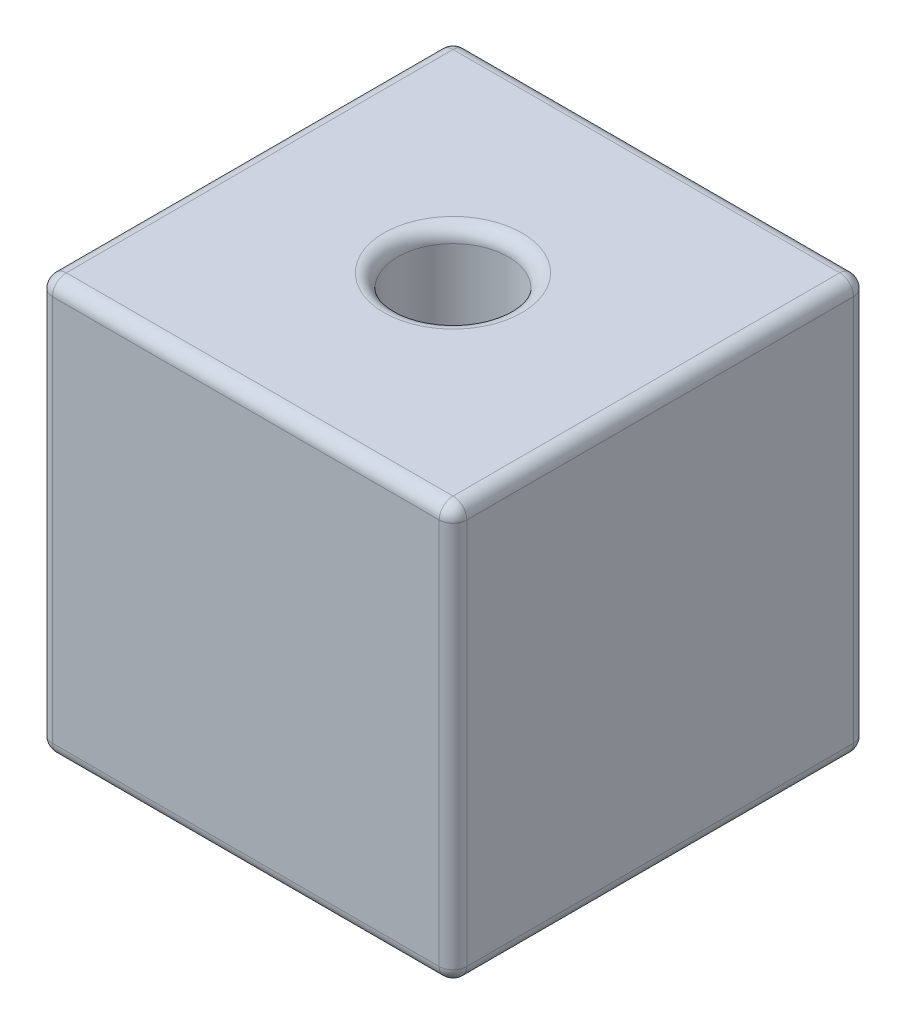
ISO-10303-21;
HEADER;
FILE_DESCRIPTION(('STEP AP214'),'2;1');
FILE_NAME('part.step','',(''),(''),'','','');
FILE_SCHEMA(('AUTOMOTIVE_DESIGN { 1 0 10303 214 1 1 1 1 }'));
ENDSEC;
DATA;
#1=APPLICATION_CONTEXT('core data for automotive mechanical design processes');
#2=APPLICATION_PROTOCOL_DEFINITION('international standard','automotive_design',2000,#1);
#3=PRODUCT_CONTEXT('',#1,'mechanical');
#4=PRODUCT('Part','Part','',(#3));
#5=PRODUCT_RELATED_PRODUCT_CATEGORY('part','',(#4));
#6=PRODUCT_DEFINITION_FORMATION('','',#4);
#7=PRODUCT_DEFINITION_CONTEXT('part definition',#1,'design');
#8=PRODUCT_DEFINITION('design','',#6,#7);
#9=PRODUCT_DEFINITION_SHAPE('','',#8);
#10=(LENGTH_UNIT() NAMED_UNIT(*) SI_UNIT(.MILLI.,.METRE.));
#11=(NAMED_UNIT(*) PLANE_ANGLE_UNIT() SI_UNIT($,.RADIAN.));
#12=(NAMED_UNIT(*) SI_UNIT($,.STERADIAN.) SOLID_ANGLE_UNIT());
#13=UNCERTAINTY_MEASURE_WITH_UNIT(LENGTH_MEASURE(1.E-05),#10,'distance_accuracy_value','');
#14=(GEOMETRIC_REPRESENTATION_CONTEXT(3) GLOBAL_UNCERTAINTY_ASSIGNED_CONTEXT((#13)) GLOBAL_UNIT_ASSIGNED_CONTEXT((#10,
#11,#12)) REPRESENTATION_CONTEXT('',''));
#15=CARTESIAN_POINT('',(0.,0.,0.));
#16=DIRECTION('',(0.,0.,1.));
#17=DIRECTION('',(1.,0.,0.));
#18=AXIS2_PLACEMENT_3D('',#15,#16,#17);
#19=CARTESIAN_POINT('',(15.,30.,-15.));
#20=DIRECTION('',(-1.,0.,0.));
#21=DIRECTION('',(0.,0.,1.));
#22=AXIS2_PLACEMENT_3D('',#19,#20,#21);
#23=PLANE('',#22);
#24=DIRECTION('',(0.,-1.,0.));
#25=VECTOR('',#24,1.);
#26=CARTESIAN_POINT('',(15.,30.,14.));
#27=LINE('',#26,#25);
#28=CARTESIAN_POINT('',(15.,29.,14.));
#29=VERTEX_POINT('',#28);
#30=CARTESIAN_POINT('',(15.,1.,14.));
#31=VERTEX_POINT('',#30);
#32=EDGE_CURVE('E155',#29,#31,#27,.T.);
#33=ORIENTED_EDGE('',*,*,#32,.T.);
#34=DIRECTION('',(0.,0.,-1.));
#35=VECTOR('',#34,1.);
#36=CARTESIAN_POINT('',(15.,1.,-15.));
#37=LINE('',#36,#35);
#38=CARTESIAN_POINT('',(15.,1.,-14.));
#39=VERTEX_POINT('',#38);
#40=EDGE_CURVE('E193',#31,#39,#37,.T.);
#41=ORIENTED_EDGE('',*,*,#40,.T.);
#42=DIRECTION('',(0.,-1.,0.));
#43=VECTOR('',#42,1.);
#44=CARTESIAN_POINT('',(15.,30.,-14.));
#45=LINE('',#44,#43);
#46=CARTESIAN_POINT('',(15.,29.,-14.));
#47=VERTEX_POINT('',#46);
#48=EDGE_CURVE('E190',#39,#47,#45,.F.);
#49=ORIENTED_EDGE('',*,*,#48,.T.);
#50=DIRECTION('',(0.,0.,-1.));
#51=VECTOR('',#50,1.);
#52=CARTESIAN_POINT('',(15.,29.,15.));
#53=LINE('',#52,#51);
#54=EDGE_CURVE('E188',#47,#29,#53,.F.);
#55=ORIENTED_EDGE('',*,*,#54,.T.);
#56=EDGE_LOOP('',(#33,#41,#49,#55));
#57=FACE_BOUND('',#56,.T.);
#58=ADVANCED_FACE('F47',(#57),#23,.F.);
#59=CARTESIAN_POINT('',(-15.,30.,-15.));
#60=DIRECTION('',(0.,0.,1.));
#61=DIRECTION('',(1.,0.,0.));
#62=AXIS2_PLACEMENT_3D('',#59,#60,#61);
#63=PLANE('',#62);
#64=DIRECTION('',(0.,-1.,0.));
#65=VECTOR('',#64,1.);
#66=CARTESIAN_POINT('',(14.,30.,-15.));
#67=LINE('',#66,#65);
#68=CARTESIAN_POINT('',(14.,29.,-15.));
#69=VERTEX_POINT('',#68);
#70=CARTESIAN_POINT('',(14.,1.,-15.));
#71=VERTEX_POINT('',#70);
#72=EDGE_CURVE('E199',#69,#71,#67,.T.);
#73=ORIENTED_EDGE('',*,*,#72,.T.);
#74=DIRECTION('',(-1.,0.,0.));
#75=VECTOR('',#74,1.);
#76=CARTESIAN_POINT('',(-15.,1.,-15.));
#77=LINE('',#76,#75);
#78=CARTESIAN_POINT('',(-14.,1.,-15.));
#79=VERTEX_POINT('',#78);
#80=EDGE_CURVE('E202',#71,#79,#77,.T.);
#81=ORIENTED_EDGE('',*,*,#80,.T.);
#82=DIRECTION('',(0.,-1.,0.));
#83=VECTOR('',#82,1.);
#84=CARTESIAN_POINT('',(-14.,30.,-15.));
#85=LINE('',#84,#83);
#86=CARTESIAN_POINT('',(-14.,29.,-15.));
#87=VERTEX_POINT('',#86);
#88=EDGE_CURVE('E197',#79,#87,#85,.F.);
#89=ORIENTED_EDGE('',*,*,#88,.T.);
#90=DIRECTION('',(-1.,0.,0.));
#91=VECTOR('',#90,1.);
#92=CARTESIAN_POINT('',(15.,29.,-15.));
#93=LINE('',#92,#91);
#94=EDGE_CURVE('E195',#87,#69,#93,.F.);
#95=ORIENTED_EDGE('',*,*,#94,.T.);
#96=EDGE_LOOP('',(#73,#81,#89,#95));
#97=FACE_BOUND('',#96,.T.);
#98=ADVANCED_FACE('F320',(#97),#63,.F.);
#99=CARTESIAN_POINT('',(-15.,30.,-15.));
#100=DIRECTION('',(1.,0.,0.));
#101=DIRECTION('',(0.,0.,-1.));
#102=AXIS2_PLACEMENT_3D('',#99,#100,#101);
#103=PLANE('',#102);
#104=DIRECTION('',(0.,-1.,0.));
#105=VECTOR('',#104,1.);
#106=CARTESIAN_POINT('',(-15.,30.,-14.));
#107=LINE('',#106,#105);
#108=CARTESIAN_POINT('',(-15.,29.,-14.));
#109=VERTEX_POINT('',#108);
#110=CARTESIAN_POINT('',(-15.,1.,-14.));
#111=VERTEX_POINT('',#110);
#112=EDGE_CURVE('E181',#109,#111,#107,.T.);
#113=ORIENTED_EDGE('',*,*,#112,.T.);
#114=DIRECTION('',(0.,0.,1.));
#115=VECTOR('',#114,1.);
#116=CARTESIAN_POINT('',(-15.,1.,-15.));
#117=LINE('',#116,#115);
#118=CARTESIAN_POINT('',(-15.,1.,14.));
#119=VERTEX_POINT('',#118);
#120=EDGE_CURVE('E186',#111,#119,#117,.T.);
#121=ORIENTED_EDGE('',*,*,#120,.T.);
#122=DIRECTION('',(0.,-1.,0.));
#123=VECTOR('',#122,1.);
#124=CARTESIAN_POINT('',(-15.,30.,14.));
#125=LINE('',#124,#123);
#126=CARTESIAN_POINT('',(-15.,29.,14.));
#127=VERTEX_POINT('',#126);
#128=EDGE_CURVE('E183',#119,#127,#125,.F.);
#129=ORIENTED_EDGE('',*,*,#128,.T.);
#130=DIRECTION('',(0.,0.,1.));
#131=VECTOR('',#130,1.);
#132=CARTESIAN_POINT('',(-15.,29.,-15.));
#133=LINE('',#132,#131);
#134=EDGE_CURVE('E179',#127,#109,#133,.F.);
#135=ORIENTED_EDGE('',*,*,#134,.T.);
#136=EDGE_LOOP('',(#113,#121,#129,#135));
#137=FACE_BOUND('',#136,.T.);
#138=ADVANCED_FACE('F311',(#137),#103,.F.);
#139=CARTESIAN_POINT('',(-15.,30.,15.));
#140=DIRECTION('',(0.,0.,-1.));
#141=DIRECTION('',(-1.,0.,0.));
#142=AXIS2_PLACEMENT_3D('',#139,#140,#141);
#143=PLANE('',#142);
#144=DIRECTION('',(0.,-1.,0.));
#145=VECTOR('',#144,1.);
#146=CARTESIAN_POINT('',(-14.,30.,15.));
#147=LINE('',#146,#145);
#148=CARTESIAN_POINT('',(-14.,29.,15.));
#149=VERTEX_POINT('',#148);
#150=CARTESIAN_POINT('',(-14.,1.,15.));
#151=VERTEX_POINT('',#150);
#152=EDGE_CURVE('E147',#149,#151,#147,.T.);
#153=ORIENTED_EDGE('',*,*,#152,.T.);
#154=DIRECTION('',(1.,0.,0.));
#155=VECTOR('',#154,1.);
#156=CARTESIAN_POINT('',(-15.,1.,15.));
#157=LINE('',#156,#155);
#158=CARTESIAN_POINT('',(14.,1.,15.));
#159=VERTEX_POINT('',#158);
#160=EDGE_CURVE('E143',#151,#159,#157,.T.);
#161=ORIENTED_EDGE('',*,*,#160,.T.);
#162=DIRECTION('',(0.,-1.,0.));
#163=VECTOR('',#162,1.);
#164=CARTESIAN_POINT('',(14.,30.,15.));
#165=LINE('',#164,#163);
#166=CARTESIAN_POINT('',(14.,29.,15.));
#167=VERTEX_POINT('',#166);
#168=EDGE_CURVE('E135',#159,#167,#165,.F.);
#169=ORIENTED_EDGE('',*,*,#168,.T.);
#170=DIRECTION('',(1.,0.,0.));
#171=VECTOR('',#170,1.);
#172=CARTESIAN_POINT('',(-15.,29.,15.));
#173=LINE('',#172,#171);
#174=EDGE_CURVE('E140',#167,#149,#173,.F.);
#175=ORIENTED_EDGE('',*,*,#174,.T.);
#176=EDGE_LOOP('',(#153,#161,#169,#175));
#177=FACE_BOUND('',#176,.T.);
#178=ADVANCED_FACE('F138',(#177),#143,.F.);
#179=CARTESIAN_POINT('',(0.,30.,0.));
#180=DIRECTION('',(0.,1.,0.));
#181=DIRECTION('',(0.,0.,1.));
#182=AXIS2_PLACEMENT_3D('',#179,#180,#181);
#183=PLANE('',#182);
#184=DIRECTION('',(0.,0.,1.));
#185=VECTOR('',#184,1.);
#186=CARTESIAN_POINT('',(-14.,30.,15.));
#187=LINE('',#186,#185);
#188=CARTESIAN_POINT('',(-14.,30.,-14.));
#189=VERTEX_POINT('',#188);
#190=CARTESIAN_POINT('',(-14.,30.,14.));
#191=VERTEX_POINT('',#190);
#192=EDGE_CURVE('E56',#189,#191,#187,.T.);
#193=ORIENTED_EDGE('',*,*,#192,.T.);
#194=DIRECTION('',(1.,0.,0.));
#195=VECTOR('',#194,1.);
#196=CARTESIAN_POINT('',(15.,30.,14.));
#197=LINE('',#196,#195);
#198=CARTESIAN_POINT('',(14.,30.,14.));
#199=VERTEX_POINT('',#198);
#200=EDGE_CURVE('E11',#191,#199,#197,.T.);
#201=ORIENTED_EDGE('',*,*,#200,.T.);
#202=DIRECTION('',(0.,0.,-1.));
#203=VECTOR('',#202,1.);
#204=CARTESIAN_POINT('',(14.,30.,-15.));
#205=LINE('',#204,#203);
#206=CARTESIAN_POINT('',(14.,30.,-14.));
#207=VERTEX_POINT('',#206);
#208=EDGE_CURVE('E225',#199,#207,#205,.T.);
#209=ORIENTED_EDGE('',*,*,#208,.T.);
#210=DIRECTION('',(-1.,0.,0.));
#211=VECTOR('',#210,1.);
#212=CARTESIAN_POINT('',(-15.,30.,-14.));
#213=LINE('',#212,#211);
#214=EDGE_CURVE('E67',#207,#189,#213,.T.);
#215=ORIENTED_EDGE('',*,*,#214,.T.);
#216=EDGE_LOOP('',(#193,#201,#209,#215));
#217=FACE_BOUND('',#216,.T.);
#218=CARTESIAN_POINT('',(0.,30.,0.));
#219=DIRECTION('',(0.,1.,0.));
#220=DIRECTION('',(0.,0.,1.));
#221=AXIS2_PLACEMENT_3D('',#218,#219,#220);
#222=CIRCLE('',#221,5.);
#223=CARTESIAN_POINT('',(0.,30.,5.));
#224=VERTEX_POINT('',#223);
#225=EDGE_CURVE('E222',#224,#224,#222,.F.);
#226=ORIENTED_EDGE('',*,*,#225,.T.);
#227=EDGE_LOOP('',(#226));
#228=FACE_BOUND('',#227,.T.);
#229=ADVANCED_FACE('F334',(#217,#228),#183,.T.);
#230=CARTESIAN_POINT('',(0.,0.,0.));
#231=DIRECTION('',(0.,1.,0.));
#232=DIRECTION('',(0.,0.,1.));
#233=AXIS2_PLACEMENT_3D('',#230,#231,#232);
#234=PLANE('',#233);
#235=DIRECTION('',(0.,0.,1.));
#236=VECTOR('',#235,1.);
#237=CARTESIAN_POINT('',(-14.,0.,0.));
#238=LINE('',#237,#236);
#239=CARTESIAN_POINT('',(-14.,0.,14.));
#240=VERTEX_POINT('',#239);
#241=CARTESIAN_POINT('',(-14.,0.,-14.));
#242=VERTEX_POINT('',#241);
#243=EDGE_CURVE('E211',#240,#242,#238,.F.);
#244=ORIENTED_EDGE('',*,*,#243,.T.);
#245=DIRECTION('',(-1.,0.,0.));
#246=VECTOR('',#245,1.);
#247=CARTESIAN_POINT('',(0.,0.,-14.));
#248=LINE('',#247,#246);
#249=CARTESIAN_POINT('',(14.,0.,-14.));
#250=VERTEX_POINT('',#249);
#251=EDGE_CURVE('E213',#242,#250,#248,.F.);
#252=ORIENTED_EDGE('',*,*,#251,.T.);
#253=DIRECTION('',(0.,0.,-1.));
#254=VECTOR('',#253,1.);
#255=CARTESIAN_POINT('',(14.,0.,0.));
#256=LINE('',#255,#254);
#257=CARTESIAN_POINT('',(14.,0.,14.));
#258=VERTEX_POINT('',#257);
#259=EDGE_CURVE('E207',#250,#258,#256,.F.);
#260=ORIENTED_EDGE('',*,*,#259,.T.);
#261=DIRECTION('',(1.,0.,0.));
#262=VECTOR('',#261,1.);
#263=CARTESIAN_POINT('',(0.,0.,14.));
#264=LINE('',#263,#262);
#265=EDGE_CURVE('E209',#258,#240,#264,.F.);
#266=ORIENTED_EDGE('',*,*,#265,.T.);
#267=EDGE_LOOP('',(#244,#252,#260,#266));
#268=FACE_BOUND('',#267,.T.);
#269=CARTESIAN_POINT('',(0.,0.,0.));
#270=DIRECTION('',(0.,1.,0.));
#271=DIRECTION('',(0.,0.,1.));
#272=AXIS2_PLACEMENT_3D('',#269,#270,#271);
#273=CIRCLE('',#272,5.);
#274=CARTESIAN_POINT('',(0.,0.,5.));
#275=VERTEX_POINT('',#274);
#276=EDGE_CURVE('E204',#275,#275,#273,.T.);
#277=ORIENTED_EDGE('',*,*,#276,.T.);
#278=EDGE_LOOP('',(#277));
#279=FACE_BOUND('',#278,.T.);
#280=ADVANCED_FACE('F292',(#268,#279),#234,.F.);
#281=CARTESIAN_POINT('',(0.,-1.,0.));
#282=DIRECTION('',(0.,1.,0.));
#283=DIRECTION('',(0.,0.,1.));
#284=AXIS2_PLACEMENT_3D('',#281,#282,#283);
#285=CYLINDRICAL_SURFACE('',#284,4.);
#286=CARTESIAN_POINT('',(0.,1.,0.));
#287=DIRECTION('',(0.,1.,0.));
#288=DIRECTION('',(0.,0.,1.));
#289=AXIS2_PLACEMENT_3D('',#286,#287,#288);
#290=CIRCLE('',#289,4.);
#291=CARTESIAN_POINT('',(0.,1.,4.));
#292=VERTEX_POINT('',#291);
#293=EDGE_CURVE('E219',#292,#292,#290,.F.);
#294=ORIENTED_EDGE('',*,*,#293,.T.);
#295=EDGE_LOOP('',(#294));
#296=FACE_BOUND('',#295,.T.);
#297=CARTESIAN_POINT('',(0.,29.,0.));
#298=DIRECTION('',(0.,1.,0.));
#299=DIRECTION('',(0.,0.,1.));
#300=AXIS2_PLACEMENT_3D('',#297,#298,#299);
#301=CIRCLE('',#300,4.);
#302=CARTESIAN_POINT('',(0.,29.,4.));
#303=VERTEX_POINT('',#302);
#304=EDGE_CURVE('E216',#303,#303,#301,.T.);
#305=ORIENTED_EDGE('',*,*,#304,.T.);
#306=EDGE_LOOP('',(#305));
#307=FACE_BOUND('',#306,.T.);
#308=ADVANCED_FACE('F524',(#296,#307),#285,.F.);
#309=CARTESIAN_POINT('',(14.,30.,-14.));
#310=DIRECTION('',(0.,-1.,0.));
#311=DIRECTION('',(0.,0.,-1.));
#312=AXIS2_PLACEMENT_3D('',#309,#310,#311);
#313=CYLINDRICAL_SURFACE('',#312,1.);
#314=CARTESIAN_POINT('',(14.,29.,-14.));
#315=DIRECTION('',(0.,1.,0.));
#316=DIRECTION('',(0.,0.,1.));
#317=AXIS2_PLACEMENT_3D('',#314,#315,#316);
#318=CIRCLE('',#317,1.);
#319=EDGE_CURVE('E51',#47,#69,#318,.T.);
#320=ORIENTED_EDGE('',*,*,#319,.F.);
#321=ORIENTED_EDGE('',*,*,#48,.F.);
#322=CARTESIAN_POINT('',(14.,1.,-14.));
#323=DIRECTION('',(0.,-1.,0.));
#324=DIRECTION('',(0.,0.,-1.));
#325=AXIS2_PLACEMENT_3D('',#322,#323,#324);
#326=CIRCLE('',#325,1.);
#327=EDGE_CURVE('E175',#71,#39,#326,.T.);
#328=ORIENTED_EDGE('',*,*,#327,.F.);
#329=ORIENTED_EDGE('',*,*,#72,.F.);
#330=EDGE_LOOP('',(#320,#321,#328,#329));
#331=FACE_BOUND('',#330,.T.);
#332=ADVANCED_FACE('F330',(#331),#313,.T.);
#333=CARTESIAN_POINT('',(14.,29.,-14.));
#334=DIRECTION('',(0.,0.,-1.));
#335=DIRECTION('',(-1.,0.,0.));
#336=AXIS2_PLACEMENT_3D('',#333,#334,#335);
#337=SPHERICAL_SURFACE('',#336,1.);
#338=CARTESIAN_POINT('',(14.,29.,-14.));
#339=DIRECTION('',(0.,0.,-1.));
#340=DIRECTION('',(-1.,0.,0.));
#341=AXIS2_PLACEMENT_3D('',#338,#339,#340);
#342=CIRCLE('',#341,1.);
#343=EDGE_CURVE('E272',#47,#207,#342,.F.);
#344=ORIENTED_EDGE('',*,*,#343,.F.);
#345=ORIENTED_EDGE('',*,*,#319,.T.);
#346=CARTESIAN_POINT('',(14.,29.,-14.));
#347=DIRECTION('',(1.,0.,0.));
#348=DIRECTION('',(0.,0.,-1.));
#349=AXIS2_PLACEMENT_3D('',#346,#347,#348);
#350=CIRCLE('',#349,1.);
#351=EDGE_CURVE('E275',#207,#69,#350,.F.);
#352=ORIENTED_EDGE('',*,*,#351,.F.);
#353=EDGE_LOOP('',(#344,#345,#352));
#354=FACE_BOUND('',#353,.T.);
#355=ADVANCED_FACE('F327',(#354),#337,.T.);
#356=CARTESIAN_POINT('',(14.,1.,-14.));
#357=DIRECTION('',(1.,0.,0.));
#358=DIRECTION('',(0.,1.,0.));
#359=AXIS2_PLACEMENT_3D('',#356,#357,#358);
#360=SPHERICAL_SURFACE('',#359,1.);
#361=CARTESIAN_POINT('',(14.,1.,-14.));
#362=DIRECTION('',(1.,0.,0.));
#363=DIRECTION('',(0.,0.,-1.));
#364=AXIS2_PLACEMENT_3D('',#361,#362,#363);
#365=CIRCLE('',#364,1.);
#366=EDGE_CURVE('E266',#71,#250,#365,.F.);
#367=ORIENTED_EDGE('',*,*,#366,.F.);
#368=ORIENTED_EDGE('',*,*,#327,.T.);
#369=CARTESIAN_POINT('',(14.,1.,-14.));
#370=DIRECTION('',(0.,0.,-1.));
#371=DIRECTION('',(-1.,0.,0.));
#372=AXIS2_PLACEMENT_3D('',#369,#370,#371);
#373=CIRCLE('',#372,1.);
#374=EDGE_CURVE('E269',#250,#39,#373,.F.);
#375=ORIENTED_EDGE('',*,*,#374,.F.);
#376=EDGE_LOOP('',(#367,#368,#375));
#377=FACE_BOUND('',#376,.T.);
#378=ADVANCED_FACE('F282',(#377),#360,.T.);
#379=CARTESIAN_POINT('',(0.,29.,-14.));
#380=DIRECTION('',(1.,0.,0.));
#381=DIRECTION('',(0.,0.,-1.));
#382=AXIS2_PLACEMENT_3D('',#379,#380,#381);
#383=CYLINDRICAL_SURFACE('',#382,1.);
#384=ORIENTED_EDGE('',*,*,#351,.T.);
#385=ORIENTED_EDGE('',*,*,#94,.F.);
#386=CARTESIAN_POINT('',(-14.,29.,-14.));
#387=DIRECTION('',(-1.,0.,0.));
#388=DIRECTION('',(0.,0.,1.));
#389=AXIS2_PLACEMENT_3D('',#386,#387,#388);
#390=CIRCLE('',#389,1.);
#391=EDGE_CURVE('E260',#189,#87,#390,.T.);
#392=ORIENTED_EDGE('',*,*,#391,.F.);
#393=ORIENTED_EDGE('',*,*,#214,.F.);
#394=EDGE_LOOP('',(#384,#385,#392,#393));
#395=FACE_BOUND('',#394,.T.);
#396=ADVANCED_FACE('F322',(#395),#383,.T.);
#397=CARTESIAN_POINT('',(14.,29.,0.));
#398=DIRECTION('',(0.,0.,1.));
#399=DIRECTION('',(1.,0.,0.));
#400=AXIS2_PLACEMENT_3D('',#397,#398,#399);
#401=CYLINDRICAL_SURFACE('',#400,1.);
#402=ORIENTED_EDGE('',*,*,#343,.T.);
#403=ORIENTED_EDGE('',*,*,#208,.F.);
#404=CARTESIAN_POINT('',(14.,29.,14.));
#405=DIRECTION('',(0.,0.,1.));
#406=DIRECTION('',(1.,0.,0.));
#407=AXIS2_PLACEMENT_3D('',#404,#405,#406);
#408=CIRCLE('',#407,1.);
#409=EDGE_CURVE('E159',#29,#199,#408,.T.);
#410=ORIENTED_EDGE('',*,*,#409,.F.);
#411=ORIENTED_EDGE('',*,*,#54,.F.);
#412=EDGE_LOOP('',(#402,#403,#410,#411));
#413=FACE_BOUND('',#412,.T.);
#414=ADVANCED_FACE('F333',(#413),#401,.T.);
#415=CARTESIAN_POINT('',(14.,30.,14.));
#416=DIRECTION('',(0.,-1.,0.));
#417=DIRECTION('',(0.,0.,-1.));
#418=AXIS2_PLACEMENT_3D('',#415,#416,#417);
#419=CYLINDRICAL_SURFACE('',#418,1.);
#420=CARTESIAN_POINT('',(14.,1.,14.));
#421=DIRECTION('',(0.,-1.,0.));
#422=DIRECTION('',(0.,0.,-1.));
#423=AXIS2_PLACEMENT_3D('',#420,#421,#422);
#424=CIRCLE('',#423,1.);
#425=EDGE_CURVE('E160',#31,#159,#424,.T.);
#426=ORIENTED_EDGE('',*,*,#425,.F.);
#427=ORIENTED_EDGE('',*,*,#32,.F.);
#428=CARTESIAN_POINT('',(14.,29.,14.));
#429=DIRECTION('',(0.,1.,0.));
#430=DIRECTION('',(0.,0.,1.));
#431=AXIS2_PLACEMENT_3D('',#428,#429,#430);
#432=CIRCLE('',#431,1.);
#433=EDGE_CURVE('E151',#167,#29,#432,.T.);
#434=ORIENTED_EDGE('',*,*,#433,.F.);
#435=ORIENTED_EDGE('',*,*,#168,.F.);
#436=EDGE_LOOP('',(#426,#427,#434,#435));
#437=FACE_BOUND('',#436,.T.);
#438=ADVANCED_FACE('F153',(#437),#419,.T.);
#439=CARTESIAN_POINT('',(14.,1.,-15.));
#440=DIRECTION('',(0.,0.,-1.));
#441=DIRECTION('',(-1.,0.,0.));
#442=AXIS2_PLACEMENT_3D('',#439,#440,#441);
#443=CYLINDRICAL_SURFACE('',#442,1.);
#444=ORIENTED_EDGE('',*,*,#374,.T.);
#445=ORIENTED_EDGE('',*,*,#40,.F.);
#446=CARTESIAN_POINT('',(14.,1.,14.));
#447=DIRECTION('',(0.,0.,1.));
#448=DIRECTION('',(1.,0.,0.));
#449=AXIS2_PLACEMENT_3D('',#446,#447,#448);
#450=CIRCLE('',#449,1.);
#451=EDGE_CURVE('E256',#258,#31,#450,.T.);
#452=ORIENTED_EDGE('',*,*,#451,.F.);
#453=ORIENTED_EDGE('',*,*,#259,.F.);
#454=EDGE_LOOP('',(#444,#445,#452,#453));
#455=FACE_BOUND('',#454,.T.);
#456=ADVANCED_FACE('F288',(#455),#443,.T.);
#457=CARTESIAN_POINT('',(-15.,1.,-14.));
#458=DIRECTION('',(-1.,0.,0.));
#459=DIRECTION('',(0.,0.,1.));
#460=AXIS2_PLACEMENT_3D('',#457,#458,#459);
#461=CYLINDRICAL_SURFACE('',#460,1.);
#462=ORIENTED_EDGE('',*,*,#366,.T.);
#463=ORIENTED_EDGE('',*,*,#251,.F.);
#464=CARTESIAN_POINT('',(-14.,1.,-14.));
#465=DIRECTION('',(-1.,0.,0.));
#466=DIRECTION('',(0.,0.,1.));
#467=AXIS2_PLACEMENT_3D('',#464,#465,#466);
#468=CIRCLE('',#467,1.);
#469=EDGE_CURVE('E253',#79,#242,#468,.T.);
#470=ORIENTED_EDGE('',*,*,#469,.F.);
#471=ORIENTED_EDGE('',*,*,#80,.F.);
#472=EDGE_LOOP('',(#462,#463,#470,#471));
#473=FACE_BOUND('',#472,.T.);
#474=ADVANCED_FACE('F299',(#473),#461,.T.);
#475=CARTESIAN_POINT('',(-14.,30.,-14.));
#476=DIRECTION('',(0.,-1.,0.));
#477=DIRECTION('',(0.,0.,-1.));
#478=AXIS2_PLACEMENT_3D('',#475,#476,#477);
#479=CYLINDRICAL_SURFACE('',#478,1.);
#480=CARTESIAN_POINT('',(-14.,29.,-14.));
#481=DIRECTION('',(0.,1.,0.));
#482=DIRECTION('',(0.,0.,1.));
#483=AXIS2_PLACEMENT_3D('',#480,#481,#482);
#484=CIRCLE('',#483,1.);
#485=EDGE_CURVE('E263',#87,#109,#484,.T.);
#486=ORIENTED_EDGE('',*,*,#485,.F.);
#487=ORIENTED_EDGE('',*,*,#88,.F.);
#488=CARTESIAN_POINT('',(-14.,1.,-14.));
#489=DIRECTION('',(0.,-1.,0.));
#490=DIRECTION('',(0.,0.,-1.));
#491=AXIS2_PLACEMENT_3D('',#488,#489,#490);
#492=CIRCLE('',#491,1.);
#493=EDGE_CURVE('E250',#111,#79,#492,.T.);
#494=ORIENTED_EDGE('',*,*,#493,.F.);
#495=ORIENTED_EDGE('',*,*,#112,.F.);
#496=EDGE_LOOP('',(#486,#487,#494,#495));
#497=FACE_BOUND('',#496,.T.);
#498=ADVANCED_FACE('F317',(#497),#479,.T.);
#499=CARTESIAN_POINT('',(-14.,29.,-14.));
#500=DIRECTION('',(0.,0.,-1.));
#501=DIRECTION('',(-1.,0.,0.));
#502=AXIS2_PLACEMENT_3D('',#499,#500,#501);
#503=SPHERICAL_SURFACE('',#502,1.);
#504=ORIENTED_EDGE('',*,*,#391,.T.);
#505=ORIENTED_EDGE('',*,*,#485,.T.);
#506=CARTESIAN_POINT('',(-14.,29.,-14.));
#507=DIRECTION('',(0.,0.,-1.));
#508=DIRECTION('',(-1.,0.,0.));
#509=AXIS2_PLACEMENT_3D('',#506,#507,#508);
#510=CIRCLE('',#509,1.);
#511=EDGE_CURVE('E166',#189,#109,#510,.F.);
#512=ORIENTED_EDGE('',*,*,#511,.F.);
#513=EDGE_LOOP('',(#504,#505,#512));
#514=FACE_BOUND('',#513,.T.);
#515=ADVANCED_FACE('F358',(#514),#503,.T.);
#516=CARTESIAN_POINT('',(14.,29.,14.));
#517=DIRECTION('',(1.,0.,0.));
#518=DIRECTION('',(0.,0.,-1.));
#519=AXIS2_PLACEMENT_3D('',#516,#517,#518);
#520=SPHERICAL_SURFACE('',#519,1.);
#521=ORIENTED_EDGE('',*,*,#433,.T.);
#522=ORIENTED_EDGE('',*,*,#409,.T.);
#523=CARTESIAN_POINT('',(14.,29.,14.));
#524=DIRECTION('',(1.,0.,0.));
#525=DIRECTION('',(0.,0.,-1.));
#526=AXIS2_PLACEMENT_3D('',#523,#524,#525);
#527=CIRCLE('',#526,1.);
#528=EDGE_CURVE('E162',#167,#199,#527,.F.);
#529=ORIENTED_EDGE('',*,*,#528,.F.);
#530=EDGE_LOOP('',(#521,#522,#529));
#531=FACE_BOUND('',#530,.T.);
#532=ADVANCED_FACE('F163',(#531),#520,.T.);
#533=CARTESIAN_POINT('',(14.,1.,14.));
#534=DIRECTION('',(1.,0.,0.));
#535=DIRECTION('',(0.,1.,0.));
#536=AXIS2_PLACEMENT_3D('',#533,#534,#535);
#537=SPHERICAL_SURFACE('',#536,1.);
#538=ORIENTED_EDGE('',*,*,#451,.T.);
#539=ORIENTED_EDGE('',*,*,#425,.T.);
#540=CARTESIAN_POINT('',(14.,1.,14.));
#541=DIRECTION('',(1.,0.,0.));
#542=DIRECTION('',(0.,0.,-1.));
#543=AXIS2_PLACEMENT_3D('',#540,#541,#542);
#544=CIRCLE('',#543,1.);
#545=EDGE_CURVE('E167',#258,#159,#544,.F.);
#546=ORIENTED_EDGE('',*,*,#545,.F.);
#547=EDGE_LOOP('',(#538,#539,#546));
#548=FACE_BOUND('',#547,.T.);
#549=ADVANCED_FACE('F350',(#548),#537,.T.);
#550=CARTESIAN_POINT('',(-14.,1.,-14.));
#551=DIRECTION('',(0.,0.,-1.));
#552=DIRECTION('',(0.,1.,0.));
#553=AXIS2_PLACEMENT_3D('',#550,#551,#552);
#554=SPHERICAL_SURFACE('',#553,1.);
#555=ORIENTED_EDGE('',*,*,#493,.T.);
#556=ORIENTED_EDGE('',*,*,#469,.T.);
#557=CARTESIAN_POINT('',(-14.,1.,-14.));
#558=DIRECTION('',(0.,0.,-1.));
#559=DIRECTION('',(-1.,0.,0.));
#560=AXIS2_PLACEMENT_3D('',#557,#558,#559);
#561=CIRCLE('',#560,1.);
#562=EDGE_CURVE('E243',#111,#242,#561,.F.);
#563=ORIENTED_EDGE('',*,*,#562,.F.);
#564=EDGE_LOOP('',(#555,#556,#563));
#565=FACE_BOUND('',#564,.T.);
#566=ADVANCED_FACE('F302',(#565),#554,.T.);
#567=CARTESIAN_POINT('',(-14.,29.,0.));
#568=DIRECTION('',(0.,0.,-1.));
#569=DIRECTION('',(-1.,0.,0.));
#570=AXIS2_PLACEMENT_3D('',#567,#568,#569);
#571=CYLINDRICAL_SURFACE('',#570,1.);
#572=ORIENTED_EDGE('',*,*,#511,.T.);
#573=ORIENTED_EDGE('',*,*,#134,.F.);
#574=CARTESIAN_POINT('',(-14.,29.,14.));
#575=DIRECTION('',(0.,0.,1.));
#576=DIRECTION('',(1.,0.,0.));
#577=AXIS2_PLACEMENT_3D('',#574,#575,#576);
#578=CIRCLE('',#577,1.);
#579=EDGE_CURVE('E240',#191,#127,#578,.T.);
#580=ORIENTED_EDGE('',*,*,#579,.F.);
#581=ORIENTED_EDGE('',*,*,#192,.F.);
#582=EDGE_LOOP('',(#572,#573,#580,#581));
#583=FACE_BOUND('',#582,.T.);
#584=ADVANCED_FACE('F338',(#583),#571,.T.);
#585=CARTESIAN_POINT('',(0.,29.,14.));
#586=DIRECTION('',(-1.,0.,0.));
#587=DIRECTION('',(0.,0.,1.));
#588=AXIS2_PLACEMENT_3D('',#585,#586,#587);
#589=CYLINDRICAL_SURFACE('',#588,1.);
#590=ORIENTED_EDGE('',*,*,#528,.T.);
#591=ORIENTED_EDGE('',*,*,#200,.F.);
#592=CARTESIAN_POINT('',(-14.,29.,14.));
#593=DIRECTION('',(-1.,0.,0.));
#594=DIRECTION('',(0.,0.,1.));
#595=AXIS2_PLACEMENT_3D('',#592,#593,#594);
#596=CIRCLE('',#595,1.);
#597=EDGE_CURVE('E171',#149,#191,#596,.T.);
#598=ORIENTED_EDGE('',*,*,#597,.F.);
#599=ORIENTED_EDGE('',*,*,#174,.F.);
#600=EDGE_LOOP('',(#590,#591,#598,#599));
#601=FACE_BOUND('',#600,.T.);
#602=ADVANCED_FACE('F169',(#601),#589,.T.);
#603=CARTESIAN_POINT('',(-15.,1.,14.));
#604=DIRECTION('',(1.,0.,0.));
#605=DIRECTION('',(0.,0.,-1.));
#606=AXIS2_PLACEMENT_3D('',#603,#604,#605);
#607=CYLINDRICAL_SURFACE('',#606,1.);
#608=ORIENTED_EDGE('',*,*,#545,.T.);
#609=ORIENTED_EDGE('',*,*,#160,.F.);
#610=CARTESIAN_POINT('',(-14.,1.,14.));
#611=DIRECTION('',(-1.,0.,0.));
#612=DIRECTION('',(0.,0.,1.));
#613=AXIS2_PLACEMENT_3D('',#610,#611,#612);
#614=CIRCLE('',#613,1.);
#615=EDGE_CURVE('E236',#240,#151,#614,.T.);
#616=ORIENTED_EDGE('',*,*,#615,.F.);
#617=ORIENTED_EDGE('',*,*,#265,.F.);
#618=EDGE_LOOP('',(#608,#609,#616,#617));
#619=FACE_BOUND('',#618,.T.);
#620=ADVANCED_FACE('F348',(#619),#607,.T.);
#621=CARTESIAN_POINT('',(-14.,1.,-15.));
#622=DIRECTION('',(0.,0.,1.));
#623=DIRECTION('',(1.,0.,0.));
#624=AXIS2_PLACEMENT_3D('',#621,#622,#623);
#625=CYLINDRICAL_SURFACE('',#624,1.);
#626=ORIENTED_EDGE('',*,*,#562,.T.);
#627=ORIENTED_EDGE('',*,*,#243,.F.);
#628=CARTESIAN_POINT('',(-14.,1.,14.));
#629=DIRECTION('',(0.,0.,1.));
#630=DIRECTION('',(1.,0.,0.));
#631=AXIS2_PLACEMENT_3D('',#628,#629,#630);
#632=CIRCLE('',#631,1.);
#633=EDGE_CURVE('E233',#119,#240,#632,.T.);
#634=ORIENTED_EDGE('',*,*,#633,.F.);
#635=ORIENTED_EDGE('',*,*,#120,.F.);
#636=EDGE_LOOP('',(#626,#627,#634,#635));
#637=FACE_BOUND('',#636,.T.);
#638=ADVANCED_FACE('F306',(#637),#625,.T.);
#639=CARTESIAN_POINT('',(-14.,29.,14.));
#640=DIRECTION('',(0.,1.,0.));
#641=DIRECTION('',(0.,0.,1.));
#642=AXIS2_PLACEMENT_3D('',#639,#640,#641);
#643=SPHERICAL_SURFACE('',#642,1.);
#644=ORIENTED_EDGE('',*,*,#597,.T.);
#645=ORIENTED_EDGE('',*,*,#579,.T.);
#646=CARTESIAN_POINT('',(-14.,29.,14.));
#647=DIRECTION('',(0.,1.,0.));
#648=DIRECTION('',(0.,0.,1.));
#649=AXIS2_PLACEMENT_3D('',#646,#647,#648);
#650=CIRCLE('',#649,1.);
#651=EDGE_CURVE('E231',#149,#127,#650,.F.);
#652=ORIENTED_EDGE('',*,*,#651,.F.);
#653=EDGE_LOOP('',(#644,#645,#652));
#654=FACE_BOUND('',#653,.T.);
#655=ADVANCED_FACE('F340',(#654),#643,.T.);
#656=CARTESIAN_POINT('',(-14.,1.,14.));
#657=DIRECTION('',(0.,-1.,0.));
#658=DIRECTION('',(0.,0.,-1.));
#659=AXIS2_PLACEMENT_3D('',#656,#657,#658);
#660=SPHERICAL_SURFACE('',#659,1.);
#661=ORIENTED_EDGE('',*,*,#633,.T.);
#662=ORIENTED_EDGE('',*,*,#615,.T.);
#663=CARTESIAN_POINT('',(-14.,1.,14.));
#664=DIRECTION('',(0.,-1.,0.));
#665=DIRECTION('',(0.,0.,-1.));
#666=AXIS2_PLACEMENT_3D('',#663,#664,#665);
#667=CIRCLE('',#666,1.);
#668=EDGE_CURVE('E229',#119,#151,#667,.F.);
#669=ORIENTED_EDGE('',*,*,#668,.F.);
#670=EDGE_LOOP('',(#661,#662,#669));
#671=FACE_BOUND('',#670,.T.);
#672=ADVANCED_FACE('F346',(#671),#660,.T.);
#673=CARTESIAN_POINT('',(-14.,30.,14.));
#674=DIRECTION('',(0.,-1.,0.));
#675=DIRECTION('',(0.,0.,-1.));
#676=AXIS2_PLACEMENT_3D('',#673,#674,#675);
#677=CYLINDRICAL_SURFACE('',#676,1.);
#678=ORIENTED_EDGE('',*,*,#651,.T.);
#679=ORIENTED_EDGE('',*,*,#128,.F.);
#680=ORIENTED_EDGE('',*,*,#668,.T.);
#681=ORIENTED_EDGE('',*,*,#152,.F.);
#682=EDGE_LOOP('',(#678,#679,#680,#681));
#683=FACE_BOUND('',#682,.T.);
#684=ADVANCED_FACE('F343',(#683),#677,.T.);
#685=CARTESIAN_POINT('',(0.,1.,0.));
#686=DIRECTION('',(0.,1.,0.));
#687=DIRECTION('',(0.,0.,1.));
#688=AXIS2_PLACEMENT_3D('',#685,#686,#687);
#689=TOROIDAL_SURFACE('',#688,5.,1.);
#690=ORIENTED_EDGE('',*,*,#293,.F.);
#691=EDGE_LOOP('',(#690));
#692=FACE_BOUND('',#691,.T.);
#693=ORIENTED_EDGE('',*,*,#276,.F.);
#694=EDGE_LOOP('',(#693));
#695=FACE_BOUND('',#694,.T.);
#696=ADVANCED_FACE('F370',(#692,#695),#689,.T.);
#697=CARTESIAN_POINT('',(0.,29.,0.));
#698=DIRECTION('',(0.,1.,0.));
#699=DIRECTION('',(0.,0.,1.));
#700=AXIS2_PLACEMENT_3D('',#697,#698,#699);
#701=TOROIDAL_SURFACE('',#700,5.,1.);
#702=ORIENTED_EDGE('',*,*,#225,.F.);
#703=EDGE_LOOP('',(#702));
#704=FACE_BOUND('',#703,.T.);
#705=ORIENTED_EDGE('',*,*,#304,.F.);
#706=EDGE_LOOP('',(#705));
#707=FACE_BOUND('',#706,.T.);
#708=ADVANCED_FACE('F49',(#704,#707),#701,.T.);
#709=CLOSED_SHELL('',(#58,#98,#138,#178,#229,#280,#308,#332,#355,#378,#396,#414,#438,#456,#474,
#498,#515,#532,#549,#566,#584,#602,#620,#638,#655,#672,#684,#696,#708));
#710=MANIFOLD_SOLID_BREP('B2',#709);
#711=ADVANCED_BREP_SHAPE_REPRESENTATION('',(#18,#710),#14);
#712=SHAPE_DEFINITION_REPRESENTATION(#9,#711);
ENDSEC;
END-ISO-10303-21;
